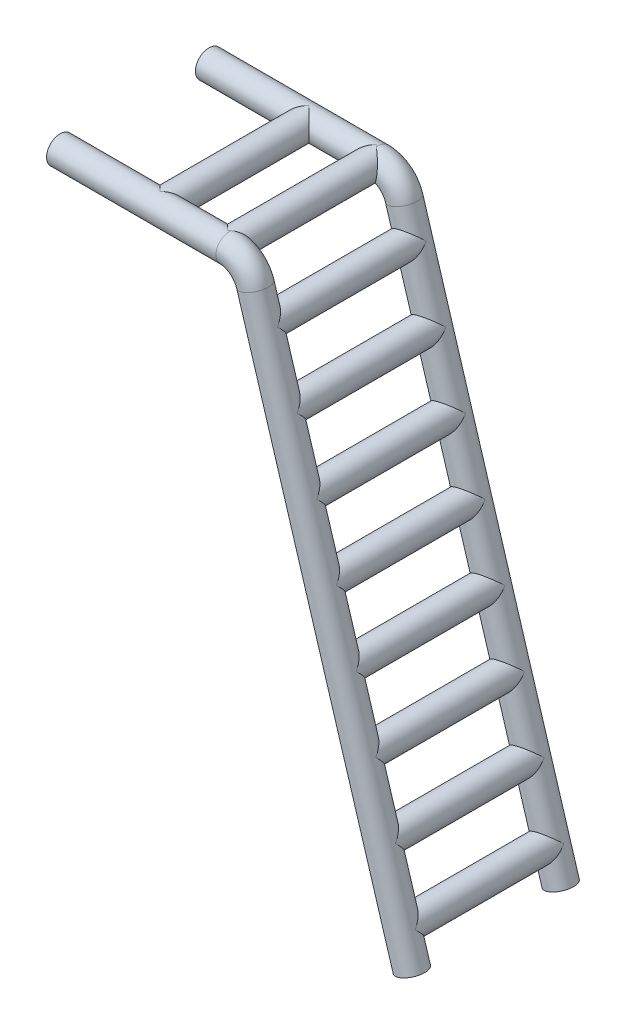
ISO-10303-21;
HEADER;
FILE_DESCRIPTION(('STEP AP214'),'2;1');
FILE_NAME('part.step','',(''),(''),'','','');
FILE_SCHEMA(('AUTOMOTIVE_DESIGN { 1 0 10303 214 1 1 1 1 }'));
ENDSEC;
DATA;
#1=APPLICATION_CONTEXT('core data for automotive mechanical design processes');
#2=APPLICATION_PROTOCOL_DEFINITION('international standard','automotive_design',2000,#1);
#3=PRODUCT_CONTEXT('',#1,'mechanical');
#4=PRODUCT('Part','Part','',(#3));
#5=PRODUCT_RELATED_PRODUCT_CATEGORY('part','',(#4));
#6=PRODUCT_DEFINITION_FORMATION('','',#4);
#7=PRODUCT_DEFINITION_CONTEXT('part definition',#1,'design');
#8=PRODUCT_DEFINITION('design','',#6,#7);
#9=PRODUCT_DEFINITION_SHAPE('','',#8);
#10=(LENGTH_UNIT() NAMED_UNIT(*) SI_UNIT(.MILLI.,.METRE.));
#11=(NAMED_UNIT(*) PLANE_ANGLE_UNIT() SI_UNIT($,.RADIAN.));
#12=(NAMED_UNIT(*) SI_UNIT($,.STERADIAN.) SOLID_ANGLE_UNIT());
#13=UNCERTAINTY_MEASURE_WITH_UNIT(LENGTH_MEASURE(1.E-05),#10,'distance_accuracy_value','');
#14=(GEOMETRIC_REPRESENTATION_CONTEXT(3) GLOBAL_UNCERTAINTY_ASSIGNED_CONTEXT((#13)) GLOBAL_UNIT_ASSIGNED_CONTEXT((#10,
#11,#12)) REPRESENTATION_CONTEXT('',''));
#15=CARTESIAN_POINT('',(0.,0.,0.));
#16=DIRECTION('',(0.,0.,1.));
#17=DIRECTION('',(1.,0.,0.));
#18=AXIS2_PLACEMENT_3D('',#15,#16,#17);
#19=CARTESIAN_POINT('',(0.,197.5,0.));
#20=DIRECTION('',(1.,0.,0.));
#21=DIRECTION('',(0.,0.,-1.));
#22=AXIS2_PLACEMENT_3D('',#19,#20,#21);
#23=CYLINDRICAL_SURFACE('',#22,5.);
#24=CARTESIAN_POINT('',(0.,197.5,0.));
#25=DIRECTION('',(1.,0.,0.));
#26=DIRECTION('',(0.,0.,-1.));
#27=AXIS2_PLACEMENT_3D('',#24,#25,#26);
#28=CIRCLE('',#27,5.);
#29=CARTESIAN_POINT('',(0.,197.5,-5.));
#30=VERTEX_POINT('',#29);
#31=EDGE_CURVE('E368',#30,#30,#28,.T.);
#32=ORIENTED_EDGE('',*,*,#31,.T.);
#33=EDGE_LOOP('',(#32));
#34=FACE_BOUND('',#33,.T.);
#35=CARTESIAN_POINT('',(61.9184050719107,197.5,0.));
#36=DIRECTION('',(0.707106781186547,0.,0.707106781186547));
#37=DIRECTION('',(0.707106781186547,0.,-0.707106781186547));
#38=AXIS2_PLACEMENT_3D('',#35,#36,#37);
#39=ELLIPSE('',#38,7.07106781186549,5.00000000000001);
#40=CARTESIAN_POINT('',(61.9184050719107,192.5,0.));
#41=VERTEX_POINT('',#40);
#42=CARTESIAN_POINT('',(61.9184050719107,202.5,0.));
#43=VERTEX_POINT('',#42);
#44=EDGE_CURVE('E364',#41,#43,#39,.F.);
#45=ORIENTED_EDGE('',*,*,#44,.T.);
#46=CARTESIAN_POINT('',(61.9184050719107,197.5,0.));
#47=DIRECTION('',(0.707106781186547,0.,-0.707106781186547));
#48=DIRECTION('',(0.707106781186547,0.,0.707106781186547));
#49=AXIS2_PLACEMENT_3D('',#46,#47,#48);
#50=ELLIPSE('',#49,7.07106781186549,5.00000000000001);
#51=CARTESIAN_POINT('',(62.5866929354734,202.455137872089,0.668287863562589));
#52=VERTEX_POINT('',#51);
#53=EDGE_CURVE('E363',#43,#52,#50,.T.);
#54=ORIENTED_EDGE('',*,*,#53,.T.);
#55=CARTESIAN_POINT('',(62.5866929354592,197.5,0.));
#56=DIRECTION('',(1.,0.,0.));
#57=DIRECTION('',(0.,0.,-1.));
#58=AXIS2_PLACEMENT_3D('',#55,#56,#57);
#59=CIRCLE('',#58,5.);
#60=CARTESIAN_POINT('',(62.5866929354592,192.544862127907,0.668287863534219));
#61=VERTEX_POINT('',#60);
#62=EDGE_CURVE('E372',#61,#52,#59,.T.);
#63=ORIENTED_EDGE('',*,*,#62,.F.);
#64=EDGE_CURVE('E359',#61,#41,#50,.T.);
#65=ORIENTED_EDGE('',*,*,#64,.T.);
#66=EDGE_LOOP('',(#45,#54,#63,#65));
#67=FACE_BOUND('',#66,.T.);
#68=CARTESIAN_POINT('',(36.9184050719107,197.5,0.));
#69=DIRECTION('',(0.707106781186547,0.,0.707106781186547));
#70=DIRECTION('',(0.707106781186547,0.,-0.707106781186547));
#71=AXIS2_PLACEMENT_3D('',#68,#69,#70);
#72=ELLIPSE('',#71,7.07106781186549,5.00000000000001);
#73=CARTESIAN_POINT('',(36.9184050719107,192.5,0.));
#74=VERTEX_POINT('',#73);
#75=CARTESIAN_POINT('',(36.9184050719107,202.5,0.));
#76=VERTEX_POINT('',#75);
#77=EDGE_CURVE('E456',#74,#76,#72,.F.);
#78=ORIENTED_EDGE('',*,*,#77,.T.);
#79=CARTESIAN_POINT('',(36.9184050719107,197.5,0.));
#80=DIRECTION('',(0.707106781186547,0.,-0.707106781186547));
#81=DIRECTION('',(0.707106781186547,0.,0.707106781186547));
#82=AXIS2_PLACEMENT_3D('',#79,#80,#81);
#83=ELLIPSE('',#82,7.07106781186549,5.00000000000001);
#84=EDGE_CURVE('E120',#76,#74,#83,.T.);
#85=ORIENTED_EDGE('',*,*,#84,.T.);
#86=EDGE_LOOP('',(#78,#85));
#87=FACE_BOUND('',#86,.T.);
#88=ADVANCED_FACE('F105',(#34,#67,#87),#23,.T.);
#89=CARTESIAN_POINT('',(62.5866929354592,187.5,0.));
#90=DIRECTION('',(0.,0.,-1.));
#91=DIRECTION('',(-1.,0.,0.));
#92=AXIS2_PLACEMENT_3D('',#89,#90,#91);
#93=TOROIDAL_SURFACE('',#92,10.,5.);
#94=CARTESIAN_POINT('',(72.1548973347256,190.406796273195,0.));
#95=DIRECTION('',(0.290679627319484,-0.956820439926638,0.));
#96=DIRECTION('',(0.,0.,-1.));
#97=AXIS2_PLACEMENT_3D('',#94,#95,#96);
#98=CIRCLE('',#97,5.);
#99=CARTESIAN_POINT('',(72.1548973347256,190.406796273195,-5.));
#100=VERTEX_POINT('',#99);
#101=EDGE_CURVE('E376',#100,#100,#98,.T.);
#102=ORIENTED_EDGE('',*,*,#101,.F.);
#103=EDGE_LOOP('',(#102));
#104=FACE_BOUND('',#103,.T.);
#105=ORIENTED_EDGE('',*,*,#62,.T.);
#106=CARTESIAN_POINT('',(62.5864929354592,202.455164841514,0.668087853629485));
#107=CARTESIAN_POINT('',(62.6611183955914,202.445139452581,0.742269202189964));
#108=CARTESIAN_POINT('',(62.7371285084318,202.433141385632,0.814720385409346));
#109=CARTESIAN_POINT('',(62.8906783188717,202.405167967597,0.95716398057671));
#110=CARTESIAN_POINT('',(62.9682176335223,202.389193600914,1.0271569962006));
#111=CARTESIAN_POINT('',(63.1236357269552,202.353228074582,1.16573173611183));
#112=CARTESIAN_POINT('',(63.2015145541961,202.333236321861,1.23431325037422));
#113=CARTESIAN_POINT('',(63.3571175354711,202.289221019917,1.3703510263028));
#114=CARTESIAN_POINT('',(63.4348416792604,202.265197212083,1.43780721548633));
#115=CARTESIAN_POINT('',(63.6684857483693,202.186614880612,1.63991503024961));
#116=CARTESIAN_POINT('',(63.8235789969003,202.125841522905,1.77316802854014));
#117=CARTESIAN_POINT('',(64.1292589342429,201.987791959425,2.03620572088656));
#118=CARTESIAN_POINT('',(64.2798459254174,201.910516863737,2.16599064758185));
#119=CARTESIAN_POINT('',(64.5784011095229,201.737326173623,2.42499263315125));
#120=CARTESIAN_POINT('',(64.7262112438005,201.640995095594,2.55411544188455));
#121=CARTESIAN_POINT('',(65.0133266838961,201.43104335284,2.80778092509025));
#122=CARTESIAN_POINT('',(65.1526305023492,201.317419676494,2.93232279706149));
#123=CARTESIAN_POINT('',(65.4202475696997,201.073479412552,3.17545517156974));
#124=CARTESIAN_POINT('',(65.5485978949837,200.943223193934,3.29406513840678));
#125=CARTESIAN_POINT('',(65.7926474134279,200.666122678001,3.52453478897464));
#126=CARTESIAN_POINT('',(65.9083530564968,200.519286916178,3.63639790102712));
#127=CARTESIAN_POINT('',(66.1634411226332,200.154294493682,3.89035539746386));
#128=CARTESIAN_POINT('',(66.2966310579024,199.929332874801,4.02907092333381));
#129=CARTESIAN_POINT('',(66.5291759854502,199.452211931506,4.28660087547002));
#130=CARTESIAN_POINT('',(66.6285643133016,199.200079728206,4.40543485004966));
#131=CARTESIAN_POINT('',(66.7726969565931,198.719455793191,4.59818542935828));
#132=CARTESIAN_POINT('',(66.8239987429483,198.494676110905,4.67632934421049));
#133=CARTESIAN_POINT('',(66.8774652959444,198.149123890233,4.77683803552706));
#134=CARTESIAN_POINT('',(66.8913739857207,198.032494304266,4.80756535865547));
#135=CARTESIAN_POINT('',(66.9109637448681,197.797120025511,4.86284353148415));
#136=CARTESIAN_POINT('',(66.9166485531549,197.678376318764,4.88739718379211));
#137=CARTESIAN_POINT('',(66.9194781705201,197.438538409945,4.92989843284707));
#138=CARTESIAN_POINT('',(66.9165484663898,197.317432753428,4.94778687352747));
#139=CARTESIAN_POINT('',(66.9017837552902,197.074934941454,4.97602824369316));
#140=CARTESIAN_POINT('',(66.8899534446062,196.953542970727,4.98638514143035));
#141=CARTESIAN_POINT('',(66.857364716696,196.711604662361,4.99901308722723));
#142=CARTESIAN_POINT('',(66.836611751147,196.591057853967,5.00128906482182));
#143=CARTESIAN_POINT('',(66.7863511689762,196.351950692199,4.99731597497589));
#144=CARTESIAN_POINT('',(66.7568449746408,196.233390019407,4.99106829192695));
#145=CARTESIAN_POINT('',(66.6941117550653,196.015526335228,4.9712253378769));
#146=CARTESIAN_POINT('',(66.6619492724375,195.915811396035,4.95875470650152));
#147=CARTESIAN_POINT('',(66.5918028005951,195.719488810329,4.92718278067469));
#148=CARTESIAN_POINT('',(66.5538170177167,195.622882132337,4.90807944094879));
#149=CARTESIAN_POINT('',(66.4725643532017,195.433543260687,4.86330432313619));
#150=CARTESIAN_POINT('',(66.4292996795599,195.34080946876,4.83763528638301));
#151=CARTESIAN_POINT('',(66.3380625499701,195.159719512614,4.77988670457977));
#152=CARTESIAN_POINT('',(66.290088319005,195.071365017966,4.74780473775957));
#153=CARTESIAN_POINT('',(66.1919107174733,194.902630408045,4.67878528885342));
#154=CARTESIAN_POINT('',(66.1418508201996,194.822077428124,4.64206550598394));
#155=CARTESIAN_POINT('',(66.0385744836408,194.665746407216,4.56326009885023));
#156=CARTESIAN_POINT('',(65.9853568816876,194.589970146465,4.52117249151217));
#157=CARTESIAN_POINT('',(65.8219686917754,194.370233857199,4.38749396348193));
#158=CARTESIAN_POINT('',(65.7079140684997,194.233615744542,4.28838322128656));
#159=CARTESIAN_POINT('',(65.5024139139876,194.011167197106,4.09981940227379));
#160=CARTESIAN_POINT('',(65.412223546569,193.921069365195,4.01388874730614));
#161=CARTESIAN_POINT('',(65.2297559318172,193.751607090382,3.83391078912698));
#162=CARTESIAN_POINT('',(65.1374776447352,193.672248138966,3.73985937320895));
#163=CARTESIAN_POINT('',(64.9513010126918,193.523080782839,3.54430672696414));
#164=CARTESIAN_POINT('',(64.8573957439527,193.453346921135,3.44275578781625));
#165=CARTESIAN_POINT('',(64.6694113014813,193.323275715494,3.23405016982432));
#166=CARTESIAN_POINT('',(64.5753321764052,193.262936056039,3.12689688059446));
#167=CARTESIAN_POINT('',(64.4020092273746,193.159463660693,2.92499074178849));
#168=CARTESIAN_POINT('',(64.3227253134727,193.115113421258,2.83088891890509));
#169=CARTESIAN_POINT('',(64.1644765056404,193.031985513317,2.63997516761242));
#170=CARTESIAN_POINT('',(64.0855116650162,192.993208741343,2.54316280617878));
#171=CARTESIAN_POINT('',(63.9278256383166,192.920723852852,2.34722174118069));
#172=CARTESIAN_POINT('',(63.8491049840431,192.887023303637,2.24808982902537));
#173=CARTESIAN_POINT('',(63.6919318035493,192.824343590708,2.04814815240428));
#174=CARTESIAN_POINT('',(63.6134792701837,192.795364300198,1.94733843307909));
#175=CARTESIAN_POINT('',(63.458532884658,192.742422837542,1.74708160415776));
#176=CARTESIAN_POINT('',(63.3820387130041,192.71835405622,1.64766271204512));
#177=CARTESIAN_POINT('',(63.2286171486519,192.674056239257,1.44832385929399));
#178=CARTESIAN_POINT('',(63.1516898057291,192.653826771354,1.34840395636522));
#179=CARTESIAN_POINT('',(63.0352993118148,192.626179675196,1.19906916736686));
#180=CARTESIAN_POINT('',(62.9963987322633,192.617425318685,1.14946043408808));
#181=CARTESIAN_POINT('',(62.9179565850585,192.600764723479,1.05062443805327));
#182=CARTESIAN_POINT('',(62.8784151528061,192.592858308249,1.00139709788217));
#183=CARTESIAN_POINT('',(62.7982028226284,192.577843285985,0.903683032913863));
#184=CARTESIAN_POINT('',(62.7575312260473,192.570735186792,0.855196796314696));
#185=CARTESIAN_POINT('',(62.6949656918385,192.5606275375,0.783710057129077));
#186=CARTESIAN_POINT('',(62.6738428050538,192.557349639249,0.760079823345933));
#187=CARTESIAN_POINT('',(62.6308160799562,192.550965970919,0.713501459432533));
#188=CARTESIAN_POINT('',(62.6089119147417,192.547860274314,0.690553622371929));
#189=CARTESIAN_POINT('',(62.5864929354592,192.544835158486,0.668087892952457));
#190=B_SPLINE_CURVE_WITH_KNOTS('',3,(#106,#107,#108,#109,#110,#111,#112,#113,#114,#115,#116,
#117,#118,#119,#120,#121,#122,#123,#124,#125,#126,#127,#128,#129,#130,#131,#132,#133,#134,#135,
#136,#137,#138,#139,#140,#141,#142,#143,#144,#145,#146,#147,#148,#149,#150,#151,#152,#153,#154,
#155,#156,#157,#158,#159,#160,#161,#162,#163,#164,#165,#166,#167,#168,#169,#170,#171,#172,#173,
#174,#175,#176,#177,#178,#179,#180,#181,#182,#183,#184,#185,#186,#187,#188,#189),.UNSPECIFIED.,
.F.,.F.,(4,2,2,2,2,2,2,2,2,2,2,2,2,2,2,2,2,2,2,2,2,2,2,2,2,2,2,2,2,2,2,2,2,2,2,2,2,2,2,2,2,4),
(0.,0.316987456667242,0.633896515442782,0.950852392820062,1.26782860724845,1.90702102299064,
2.54617045330544,3.20120215618385,3.85634806804363,4.50918029828965,5.16167795642804,
6.04599006888245,6.92942751526569,7.6565320425575,8.020375890554,8.38405426809025,
8.75088759351942,9.1175274999047,9.48394370960626,9.8503004139906,10.1664356265297,
10.4826684098247,10.7987693733803,11.1149899351615,11.4197682437027,11.7246594766109,
12.3335230294077,12.7941667214128,13.2550450873398,13.7193134600982,14.183467216463,
14.5757053087619,14.9680064250214,15.3608866903613,15.7537564024837,16.1368820607092,
16.5199645578279,16.7108977588799,16.9017911317929,17.0928052602437,17.1883823325504,
17.2839998763865),.UNSPECIFIED.);
#191=EDGE_CURVE('E447',#52,#61,#190,.T.);
#192=ORIENTED_EDGE('',*,*,#191,.T.);
#193=EDGE_LOOP('',(#105,#192));
#194=FACE_BOUND('',#193,.T.);
#195=ADVANCED_FACE('F457',(#104,#194),#93,.T.);
#196=CARTESIAN_POINT('',(72.1548973347256,190.406796273195,0.));
#197=DIRECTION('',(0.290679627319485,-0.956820439926638,0.));
#198=DIRECTION('',(0.956820439926638,0.290679627319485,0.));
#199=AXIS2_PLACEMENT_3D('',#196,#197,#198);
#200=CYLINDRICAL_SURFACE('',#199,5.);
#201=CARTESIAN_POINT('',(130.,0.,0.));
#202=DIRECTION('',(0.290679627319485,-0.956820439926638,0.));
#203=DIRECTION('',(0.,0.,-1.));
#204=AXIS2_PLACEMENT_3D('',#201,#202,#203);
#205=CIRCLE('',#204,5.);
#206=CARTESIAN_POINT('',(130.,0.,-5.));
#207=VERTEX_POINT('',#206);
#208=EDGE_CURVE('E380',#207,#207,#205,.T.);
#209=ORIENTED_EDGE('',*,*,#208,.F.);
#210=EDGE_LOOP('',(#209));
#211=FACE_BOUND('',#210,.T.);
#212=ORIENTED_EDGE('',*,*,#101,.T.);
#213=EDGE_LOOP('',(#212));
#214=FACE_BOUND('',#213,.T.);
#215=CARTESIAN_POINT('',(126.387902166317,11.8898220358719,0.));
#216=DIRECTION('',(0.205541535630386,-0.676574221450021,0.707106781186547));
#217=DIRECTION('',(0.205541535630386,-0.676574221450021,-0.707106781186547));
#218=AXIS2_PLACEMENT_3D('',#215,#216,#217);
#219=ELLIPSE('',#218,7.07106781186549,5.00000000000001);
#220=CARTESIAN_POINT('',(121.603799966684,10.4364238992745,0.));
#221=VERTEX_POINT('',#220);
#222=CARTESIAN_POINT('',(131.172004365951,13.3432201724694,0.));
#223=VERTEX_POINT('',#222);
#224=EDGE_CURVE('E383',#221,#223,#219,.F.);
#225=ORIENTED_EDGE('',*,*,#224,.T.);
#226=CARTESIAN_POINT('',(126.387902166317,11.8898220358719,0.));
#227=DIRECTION('',(0.205541535630386,-0.676574221450021,-0.707106781186547));
#228=DIRECTION('',(0.205541535630386,-0.676574221450021,0.707106781186547));
#229=AXIS2_PLACEMENT_3D('',#226,#227,#228);
#230=ELLIPSE('',#229,7.07106781186549,5.00000000000001);
#231=EDGE_CURVE('E387',#223,#221,#230,.T.);
#232=ORIENTED_EDGE('',*,*,#231,.T.);
#233=EDGE_LOOP('',(#225,#232));
#234=FACE_BOUND('',#233,.T.);
#235=CARTESIAN_POINT('',(119.12091148333,35.8103330340379,0.));
#236=DIRECTION('',(0.205541535630386,-0.676574221450021,0.707106781186547));
#237=DIRECTION('',(0.205541535630386,-0.676574221450021,-0.707106781186547));
#238=AXIS2_PLACEMENT_3D('',#235,#236,#237);
#239=ELLIPSE('',#238,7.07106781186549,5.00000000000001);
#240=CARTESIAN_POINT('',(114.336809283697,34.3569348974405,0.));
#241=VERTEX_POINT('',#240);
#242=CARTESIAN_POINT('',(123.905013682963,37.2637311706354,0.));
#243=VERTEX_POINT('',#242);
#244=EDGE_CURVE('E391',#241,#243,#239,.F.);
#245=ORIENTED_EDGE('',*,*,#244,.T.);
#246=CARTESIAN_POINT('',(119.12091148333,35.8103330340379,0.));
#247=DIRECTION('',(0.205541535630386,-0.676574221450021,-0.707106781186547));
#248=DIRECTION('',(0.205541535630386,-0.676574221450021,0.707106781186547));
#249=AXIS2_PLACEMENT_3D('',#246,#247,#248);
#250=ELLIPSE('',#249,7.07106781186549,5.00000000000001);
#251=EDGE_CURVE('E395',#243,#241,#250,.T.);
#252=ORIENTED_EDGE('',*,*,#251,.T.);
#253=EDGE_LOOP('',(#245,#252));
#254=FACE_BOUND('',#253,.T.);
#255=CARTESIAN_POINT('',(111.853920800343,59.7308440322038,0.));
#256=DIRECTION('',(0.205541535630386,-0.676574221450021,0.707106781186547));
#257=DIRECTION('',(0.205541535630386,-0.676574221450021,-0.707106781186547));
#258=AXIS2_PLACEMENT_3D('',#255,#256,#257);
#259=ELLIPSE('',#258,7.07106781186549,5.00000000000001);
#260=CARTESIAN_POINT('',(107.06981860071,58.2774458956064,0.));
#261=VERTEX_POINT('',#260);
#262=CARTESIAN_POINT('',(116.638022999976,61.1842421688012,0.));
#263=VERTEX_POINT('',#262);
#264=EDGE_CURVE('E399',#261,#263,#259,.F.);
#265=ORIENTED_EDGE('',*,*,#264,.T.);
#266=CARTESIAN_POINT('',(111.853920800343,59.7308440322038,0.));
#267=DIRECTION('',(0.205541535630386,-0.676574221450021,-0.707106781186547));
#268=DIRECTION('',(0.205541535630386,-0.676574221450021,0.707106781186547));
#269=AXIS2_PLACEMENT_3D('',#266,#267,#268);
#270=ELLIPSE('',#269,7.07106781186549,5.00000000000001);
#271=EDGE_CURVE('E403',#263,#261,#270,.T.);
#272=ORIENTED_EDGE('',*,*,#271,.T.);
#273=EDGE_LOOP('',(#265,#272));
#274=FACE_BOUND('',#273,.T.);
#275=CARTESIAN_POINT('',(104.586930117356,83.6513550303698,0.));
#276=DIRECTION('',(0.205541535630386,-0.676574221450021,0.707106781186547));
#277=DIRECTION('',(0.205541535630386,-0.676574221450021,-0.707106781186547));
#278=AXIS2_PLACEMENT_3D('',#275,#276,#277);
#279=ELLIPSE('',#278,7.07106781186549,5.00000000000001);
#280=CARTESIAN_POINT('',(99.8028279177228,82.1979568937724,0.));
#281=VERTEX_POINT('',#280);
#282=CARTESIAN_POINT('',(109.371032316989,85.1047531669672,0.));
#283=VERTEX_POINT('',#282);
#284=EDGE_CURVE('E407',#281,#283,#279,.F.);
#285=ORIENTED_EDGE('',*,*,#284,.T.);
#286=CARTESIAN_POINT('',(104.586930117356,83.6513550303698,0.));
#287=DIRECTION('',(0.205541535630386,-0.676574221450021,-0.707106781186547));
#288=DIRECTION('',(0.205541535630386,-0.676574221450021,0.707106781186547));
#289=AXIS2_PLACEMENT_3D('',#286,#287,#288);
#290=ELLIPSE('',#289,7.07106781186549,5.00000000000001);
#291=EDGE_CURVE('E411',#283,#281,#290,.T.);
#292=ORIENTED_EDGE('',*,*,#291,.T.);
#293=EDGE_LOOP('',(#285,#292));
#294=FACE_BOUND('',#293,.T.);
#295=CARTESIAN_POINT('',(97.3199394343689,107.571866028536,0.));
#296=DIRECTION('',(0.205541535630386,-0.676574221450021,0.707106781186547));
#297=DIRECTION('',(0.205541535630386,-0.676574221450021,-0.707106781186547));
#298=AXIS2_PLACEMENT_3D('',#295,#296,#297);
#299=ELLIPSE('',#298,7.07106781186549,5.00000000000001);
#300=CARTESIAN_POINT('',(92.5358372347357,106.118467891938,0.));
#301=VERTEX_POINT('',#300);
#302=CARTESIAN_POINT('',(102.104041634002,109.025264165133,0.));
#303=VERTEX_POINT('',#302);
#304=EDGE_CURVE('E415',#301,#303,#299,.F.);
#305=ORIENTED_EDGE('',*,*,#304,.T.);
#306=CARTESIAN_POINT('',(97.3199394343689,107.571866028536,0.));
#307=DIRECTION('',(0.205541535630386,-0.676574221450021,-0.707106781186547));
#308=DIRECTION('',(0.205541535630386,-0.676574221450021,0.707106781186547));
#309=AXIS2_PLACEMENT_3D('',#306,#307,#308);
#310=ELLIPSE('',#309,7.07106781186549,5.00000000000001);
#311=EDGE_CURVE('E419',#303,#301,#310,.T.);
#312=ORIENTED_EDGE('',*,*,#311,.T.);
#313=EDGE_LOOP('',(#305,#312));
#314=FACE_BOUND('',#313,.T.);
#315=CARTESIAN_POINT('',(90.0529487513818,131.492377026702,0.));
#316=DIRECTION('',(0.205541535630386,-0.676574221450021,0.707106781186547));
#317=DIRECTION('',(0.205541535630386,-0.676574221450021,-0.707106781186547));
#318=AXIS2_PLACEMENT_3D('',#315,#316,#317);
#319=ELLIPSE('',#318,7.07106781186549,5.00000000000001);
#320=CARTESIAN_POINT('',(85.2688465517486,130.038978890104,0.));
#321=VERTEX_POINT('',#320);
#322=CARTESIAN_POINT('',(94.837050951015,132.945775163299,0.));
#323=VERTEX_POINT('',#322);
#324=EDGE_CURVE('E423',#321,#323,#319,.F.);
#325=ORIENTED_EDGE('',*,*,#324,.T.);
#326=CARTESIAN_POINT('',(90.0529487513818,131.492377026702,0.));
#327=DIRECTION('',(0.205541535630386,-0.676574221450021,-0.707106781186547));
#328=DIRECTION('',(0.205541535630386,-0.676574221450021,0.707106781186547));
#329=AXIS2_PLACEMENT_3D('',#326,#327,#328);
#330=ELLIPSE('',#329,7.07106781186549,5.00000000000001);
#331=EDGE_CURVE('E427',#323,#321,#330,.T.);
#332=ORIENTED_EDGE('',*,*,#331,.T.);
#333=EDGE_LOOP('',(#325,#332));
#334=FACE_BOUND('',#333,.T.);
#335=CARTESIAN_POINT('',(82.7859580683946,155.412888024868,0.));
#336=DIRECTION('',(0.205541535630386,-0.676574221450021,0.707106781186547));
#337=DIRECTION('',(0.205541535630386,-0.676574221450021,-0.707106781186547));
#338=AXIS2_PLACEMENT_3D('',#335,#336,#337);
#339=ELLIPSE('',#338,7.07106781186549,5.00000000000001);
#340=CARTESIAN_POINT('',(78.0018558687615,153.95948988827,0.));
#341=VERTEX_POINT('',#340);
#342=CARTESIAN_POINT('',(87.5700602680279,156.866286161465,0.));
#343=VERTEX_POINT('',#342);
#344=EDGE_CURVE('E431',#341,#343,#339,.F.);
#345=ORIENTED_EDGE('',*,*,#344,.T.);
#346=CARTESIAN_POINT('',(82.7859580683946,155.412888024868,0.));
#347=DIRECTION('',(0.205541535630386,-0.676574221450021,-0.707106781186547));
#348=DIRECTION('',(0.205541535630386,-0.676574221450021,0.707106781186547));
#349=AXIS2_PLACEMENT_3D('',#346,#347,#348);
#350=ELLIPSE('',#349,7.07106781186549,5.00000000000001);
#351=EDGE_CURVE('E435',#343,#341,#350,.T.);
#352=ORIENTED_EDGE('',*,*,#351,.T.);
#353=EDGE_LOOP('',(#345,#352));
#354=FACE_BOUND('',#353,.T.);
#355=CARTESIAN_POINT('',(75.5189673854075,179.333399023034,0.));
#356=DIRECTION('',(0.205541535630386,-0.676574221450021,0.707106781186547));
#357=DIRECTION('',(0.205541535630386,-0.676574221450021,-0.707106781186547));
#358=AXIS2_PLACEMENT_3D('',#355,#356,#357);
#359=ELLIPSE('',#358,7.07106781186549,5.00000000000001);
#360=CARTESIAN_POINT('',(70.7348651857743,177.880000886436,0.));
#361=VERTEX_POINT('',#360);
#362=CARTESIAN_POINT('',(80.3030695850407,180.786797159631,0.));
#363=VERTEX_POINT('',#362);
#364=EDGE_CURVE('E439',#361,#363,#359,.F.);
#365=ORIENTED_EDGE('',*,*,#364,.T.);
#366=CARTESIAN_POINT('',(75.5189673854075,179.333399023034,0.));
#367=DIRECTION('',(0.205541535630386,-0.676574221450021,-0.707106781186547));
#368=DIRECTION('',(0.205541535630386,-0.676574221450021,0.707106781186547));
#369=AXIS2_PLACEMENT_3D('',#366,#367,#368);
#370=ELLIPSE('',#369,7.07106781186549,5.00000000000001);
#371=EDGE_CURVE('E443',#363,#361,#370,.T.);
#372=ORIENTED_EDGE('',*,*,#371,.T.);
#373=EDGE_LOOP('',(#365,#372));
#374=FACE_BOUND('',#373,.T.);
#375=ADVANCED_FACE('F507',(#211,#214,#234,#254,#274,#294,#314,#334,#354,#374),#200,.T.);
#376=CARTESIAN_POINT('',(0.,197.5,0.));
#377=DIRECTION('',(1.,0.,0.));
#378=DIRECTION('',(0.,0.,-1.));
#379=AXIS2_PLACEMENT_3D('',#376,#377,#378);
#380=PLANE('',#379);
#381=ORIENTED_EDGE('',*,*,#31,.F.);
#382=EDGE_LOOP('',(#381));
#383=FACE_BOUND('',#382,.T.);
#384=ADVANCED_FACE('F107',(#383),#380,.F.);
#385=CARTESIAN_POINT('',(130.,0.,0.));
#386=DIRECTION('',(0.290679627319485,-0.956820439926638,0.));
#387=DIRECTION('',(0.,0.,-1.));
#388=AXIS2_PLACEMENT_3D('',#385,#386,#387);
#389=PLANE('',#388);
#390=ORIENTED_EDGE('',*,*,#208,.T.);
#391=EDGE_LOOP('',(#390));
#392=FACE_BOUND('',#391,.T.);
#393=ADVANCED_FACE('F500',(#392),#389,.T.);
#394=CARTESIAN_POINT('',(126.387902166317,11.8898220358719,55.));
#395=DIRECTION('',(0.,0.,-1.));
#396=DIRECTION('',(-1.,0.,0.));
#397=AXIS2_PLACEMENT_3D('',#394,#395,#396);
#398=CYLINDRICAL_SURFACE('',#397,5.00000000000002);
#399=ORIENTED_EDGE('',*,*,#231,.F.);
#400=ORIENTED_EDGE('',*,*,#224,.F.);
#401=EDGE_LOOP('',(#399,#400));
#402=FACE_BOUND('',#401,.T.);
#403=CARTESIAN_POINT('',(126.387902166317,11.8898220358719,55.));
#404=DIRECTION('',(-0.205541535630386,0.676574221450021,-0.707106781186547));
#405=DIRECTION('',(0.205541535630386,-0.676574221450021,-0.707106781186547));
#406=AXIS2_PLACEMENT_3D('',#403,#404,#405);
#407=ELLIPSE('',#406,7.07106781186549,5.00000000000001);
#408=CARTESIAN_POINT('',(131.172004365951,13.3432201724694,55.));
#409=VERTEX_POINT('',#408);
#410=CARTESIAN_POINT('',(121.603799966684,10.4364238992745,55.));
#411=VERTEX_POINT('',#410);
#412=EDGE_CURVE('E354',#409,#411,#407,.T.);
#413=ORIENTED_EDGE('',*,*,#412,.T.);
#414=CARTESIAN_POINT('',(126.387902166317,11.8898220358719,55.));
#415=DIRECTION('',(0.205541535630386,-0.676574221450021,-0.707106781186547));
#416=DIRECTION('',(-0.205541535630386,0.676574221450021,-0.707106781186547));
#417=AXIS2_PLACEMENT_3D('',#414,#415,#416);
#418=ELLIPSE('',#417,7.07106781186549,5.00000000000001);
#419=EDGE_CURVE('E126',#411,#409,#418,.T.);
#420=ORIENTED_EDGE('',*,*,#419,.T.);
#421=EDGE_LOOP('',(#413,#420));
#422=FACE_BOUND('',#421,.T.);
#423=ADVANCED_FACE('F497',(#402,#422),#398,.T.);
#424=CARTESIAN_POINT('',(119.12091148333,35.8103330340379,55.));
#425=DIRECTION('',(0.,0.,-1.));
#426=DIRECTION('',(-1.,0.,0.));
#427=AXIS2_PLACEMENT_3D('',#424,#425,#426);
#428=CYLINDRICAL_SURFACE('',#427,5.00000000000002);
#429=ORIENTED_EDGE('',*,*,#251,.F.);
#430=ORIENTED_EDGE('',*,*,#244,.F.);
#431=EDGE_LOOP('',(#429,#430));
#432=FACE_BOUND('',#431,.T.);
#433=CARTESIAN_POINT('',(119.12091148333,35.8103330340379,55.));
#434=DIRECTION('',(-0.205541535630386,0.676574221450021,-0.707106781186547));
#435=DIRECTION('',(0.205541535630386,-0.676574221450021,-0.707106781186547));
#436=AXIS2_PLACEMENT_3D('',#433,#434,#435);
#437=ELLIPSE('',#436,7.07106781186549,5.00000000000001);
#438=CARTESIAN_POINT('',(123.905013682963,37.2637311706354,55.));
#439=VERTEX_POINT('',#438);
#440=CARTESIAN_POINT('',(114.336809283697,34.3569348974405,55.));
#441=VERTEX_POINT('',#440);
#442=EDGE_CURVE('E349',#439,#441,#437,.T.);
#443=ORIENTED_EDGE('',*,*,#442,.T.);
#444=CARTESIAN_POINT('',(119.12091148333,35.8103330340379,55.));
#445=DIRECTION('',(0.205541535630386,-0.676574221450021,-0.707106781186547));
#446=DIRECTION('',(-0.205541535630386,0.676574221450021,-0.707106781186547));
#447=AXIS2_PLACEMENT_3D('',#444,#445,#446);
#448=ELLIPSE('',#447,7.07106781186549,5.00000000000001);
#449=EDGE_CURVE('E133',#441,#439,#448,.T.);
#450=ORIENTED_EDGE('',*,*,#449,.T.);
#451=EDGE_LOOP('',(#443,#450));
#452=FACE_BOUND('',#451,.T.);
#453=ADVANCED_FACE('F493',(#432,#452),#428,.T.);
#454=CARTESIAN_POINT('',(111.853920800343,59.7308440322038,55.));
#455=DIRECTION('',(0.,0.,-1.));
#456=DIRECTION('',(-1.,0.,0.));
#457=AXIS2_PLACEMENT_3D('',#454,#455,#456);
#458=CYLINDRICAL_SURFACE('',#457,5.00000000000002);
#459=ORIENTED_EDGE('',*,*,#271,.F.);
#460=ORIENTED_EDGE('',*,*,#264,.F.);
#461=EDGE_LOOP('',(#459,#460));
#462=FACE_BOUND('',#461,.T.);
#463=CARTESIAN_POINT('',(111.853920800343,59.7308440322038,55.));
#464=DIRECTION('',(-0.205541535630386,0.676574221450021,-0.707106781186547));
#465=DIRECTION('',(0.205541535630386,-0.676574221450021,-0.707106781186547));
#466=AXIS2_PLACEMENT_3D('',#463,#464,#465);
#467=ELLIPSE('',#466,7.07106781186549,5.00000000000001);
#468=CARTESIAN_POINT('',(116.638022999976,61.1842421688012,55.));
#469=VERTEX_POINT('',#468);
#470=CARTESIAN_POINT('',(107.06981860071,58.2774458956064,55.));
#471=VERTEX_POINT('',#470);
#472=EDGE_CURVE('E341',#469,#471,#467,.T.);
#473=ORIENTED_EDGE('',*,*,#472,.T.);
#474=CARTESIAN_POINT('',(111.853920800343,59.7308440322038,55.));
#475=DIRECTION('',(0.205541535630386,-0.676574221450021,-0.707106781186547));
#476=DIRECTION('',(-0.205541535630386,0.676574221450021,-0.707106781186547));
#477=AXIS2_PLACEMENT_3D('',#474,#475,#476);
#478=ELLIPSE('',#477,7.07106781186549,5.00000000000001);
#479=EDGE_CURVE('E345',#471,#469,#478,.T.);
#480=ORIENTED_EDGE('',*,*,#479,.T.);
#481=EDGE_LOOP('',(#473,#480));
#482=FACE_BOUND('',#481,.T.);
#483=ADVANCED_FACE('F489',(#462,#482),#458,.T.);
#484=CARTESIAN_POINT('',(104.586930117356,83.6513550303698,55.));
#485=DIRECTION('',(0.,0.,-1.));
#486=DIRECTION('',(-1.,0.,0.));
#487=AXIS2_PLACEMENT_3D('',#484,#485,#486);
#488=CYLINDRICAL_SURFACE('',#487,5.00000000000002);
#489=ORIENTED_EDGE('',*,*,#291,.F.);
#490=ORIENTED_EDGE('',*,*,#284,.F.);
#491=EDGE_LOOP('',(#489,#490));
#492=FACE_BOUND('',#491,.T.);
#493=CARTESIAN_POINT('',(104.586930117356,83.6513550303698,55.));
#494=DIRECTION('',(-0.205541535630386,0.676574221450021,-0.707106781186547));
#495=DIRECTION('',(0.205541535630386,-0.676574221450021,-0.707106781186547));
#496=AXIS2_PLACEMENT_3D('',#493,#494,#495);
#497=ELLIPSE('',#496,7.07106781186549,5.00000000000001);
#498=CARTESIAN_POINT('',(109.371032316989,85.1047531669672,55.));
#499=VERTEX_POINT('',#498);
#500=CARTESIAN_POINT('',(99.8028279177228,82.1979568937724,55.));
#501=VERTEX_POINT('',#500);
#502=EDGE_CURVE('E333',#499,#501,#497,.T.);
#503=ORIENTED_EDGE('',*,*,#502,.T.);
#504=CARTESIAN_POINT('',(104.586930117356,83.6513550303698,55.));
#505=DIRECTION('',(0.205541535630386,-0.676574221450021,-0.707106781186547));
#506=DIRECTION('',(-0.205541535630386,0.676574221450021,-0.707106781186547));
#507=AXIS2_PLACEMENT_3D('',#504,#505,#506);
#508=ELLIPSE('',#507,7.07106781186549,5.00000000000001);
#509=EDGE_CURVE('E337',#501,#499,#508,.T.);
#510=ORIENTED_EDGE('',*,*,#509,.T.);
#511=EDGE_LOOP('',(#503,#510));
#512=FACE_BOUND('',#511,.T.);
#513=ADVANCED_FACE('F485',(#492,#512),#488,.T.);
#514=CARTESIAN_POINT('',(97.3199394343689,107.571866028536,55.));
#515=DIRECTION('',(0.,0.,-1.));
#516=DIRECTION('',(-1.,0.,0.));
#517=AXIS2_PLACEMENT_3D('',#514,#515,#516);
#518=CYLINDRICAL_SURFACE('',#517,5.00000000000002);
#519=ORIENTED_EDGE('',*,*,#311,.F.);
#520=ORIENTED_EDGE('',*,*,#304,.F.);
#521=EDGE_LOOP('',(#519,#520));
#522=FACE_BOUND('',#521,.T.);
#523=CARTESIAN_POINT('',(97.3199394343689,107.571866028536,55.));
#524=DIRECTION('',(-0.205541535630386,0.676574221450021,-0.707106781186547));
#525=DIRECTION('',(0.205541535630386,-0.676574221450021,-0.707106781186547));
#526=AXIS2_PLACEMENT_3D('',#523,#524,#525);
#527=ELLIPSE('',#526,7.07106781186549,5.00000000000001);
#528=CARTESIAN_POINT('',(102.104041634002,109.025264165133,55.));
#529=VERTEX_POINT('',#528);
#530=CARTESIAN_POINT('',(92.5358372347357,106.118467891938,55.));
#531=VERTEX_POINT('',#530);
#532=EDGE_CURVE('E325',#529,#531,#527,.T.);
#533=ORIENTED_EDGE('',*,*,#532,.T.);
#534=CARTESIAN_POINT('',(97.3199394343689,107.571866028536,55.));
#535=DIRECTION('',(0.205541535630386,-0.676574221450021,-0.707106781186547));
#536=DIRECTION('',(-0.205541535630386,0.676574221450021,-0.707106781186547));
#537=AXIS2_PLACEMENT_3D('',#534,#535,#536);
#538=ELLIPSE('',#537,7.07106781186549,5.00000000000001);
#539=EDGE_CURVE('E329',#531,#529,#538,.T.);
#540=ORIENTED_EDGE('',*,*,#539,.T.);
#541=EDGE_LOOP('',(#533,#540));
#542=FACE_BOUND('',#541,.T.);
#543=ADVANCED_FACE('F481',(#522,#542),#518,.T.);
#544=CARTESIAN_POINT('',(90.0529487513818,131.492377026702,55.));
#545=DIRECTION('',(0.,0.,-1.));
#546=DIRECTION('',(-1.,0.,0.));
#547=AXIS2_PLACEMENT_3D('',#544,#545,#546);
#548=CYLINDRICAL_SURFACE('',#547,5.00000000000002);
#549=ORIENTED_EDGE('',*,*,#331,.F.);
#550=ORIENTED_EDGE('',*,*,#324,.F.);
#551=EDGE_LOOP('',(#549,#550));
#552=FACE_BOUND('',#551,.T.);
#553=CARTESIAN_POINT('',(90.0529487513818,131.492377026702,55.));
#554=DIRECTION('',(-0.205541535630386,0.676574221450021,-0.707106781186547));
#555=DIRECTION('',(0.205541535630386,-0.676574221450021,-0.707106781186547));
#556=AXIS2_PLACEMENT_3D('',#553,#554,#555);
#557=ELLIPSE('',#556,7.07106781186549,5.00000000000001);
#558=CARTESIAN_POINT('',(94.837050951015,132.945775163299,55.));
#559=VERTEX_POINT('',#558);
#560=CARTESIAN_POINT('',(85.2688465517486,130.038978890104,55.));
#561=VERTEX_POINT('',#560);
#562=EDGE_CURVE('E317',#559,#561,#557,.T.);
#563=ORIENTED_EDGE('',*,*,#562,.T.);
#564=CARTESIAN_POINT('',(90.0529487513818,131.492377026702,55.));
#565=DIRECTION('',(0.205541535630386,-0.676574221450021,-0.707106781186547));
#566=DIRECTION('',(-0.205541535630386,0.676574221450021,-0.707106781186547));
#567=AXIS2_PLACEMENT_3D('',#564,#565,#566);
#568=ELLIPSE('',#567,7.07106781186549,5.00000000000001);
#569=EDGE_CURVE('E321',#561,#559,#568,.T.);
#570=ORIENTED_EDGE('',*,*,#569,.T.);
#571=EDGE_LOOP('',(#563,#570));
#572=FACE_BOUND('',#571,.T.);
#573=ADVANCED_FACE('F477',(#552,#572),#548,.T.);
#574=CARTESIAN_POINT('',(82.7859580683946,155.412888024868,55.));
#575=DIRECTION('',(0.,0.,-1.));
#576=DIRECTION('',(-1.,0.,0.));
#577=AXIS2_PLACEMENT_3D('',#574,#575,#576);
#578=CYLINDRICAL_SURFACE('',#577,5.00000000000002);
#579=ORIENTED_EDGE('',*,*,#351,.F.);
#580=ORIENTED_EDGE('',*,*,#344,.F.);
#581=EDGE_LOOP('',(#579,#580));
#582=FACE_BOUND('',#581,.T.);
#583=CARTESIAN_POINT('',(82.7859580683946,155.412888024868,55.));
#584=DIRECTION('',(-0.205541535630386,0.676574221450021,-0.707106781186547));
#585=DIRECTION('',(0.205541535630386,-0.676574221450021,-0.707106781186547));
#586=AXIS2_PLACEMENT_3D('',#583,#584,#585);
#587=ELLIPSE('',#586,7.07106781186549,5.00000000000001);
#588=CARTESIAN_POINT('',(87.5700602680279,156.866286161465,55.));
#589=VERTEX_POINT('',#588);
#590=CARTESIAN_POINT('',(78.0018558687615,153.95948988827,55.));
#591=VERTEX_POINT('',#590);
#592=EDGE_CURVE('E309',#589,#591,#587,.T.);
#593=ORIENTED_EDGE('',*,*,#592,.T.);
#594=CARTESIAN_POINT('',(82.7859580683946,155.412888024868,55.));
#595=DIRECTION('',(0.205541535630386,-0.676574221450021,-0.707106781186547));
#596=DIRECTION('',(-0.205541535630386,0.676574221450021,-0.707106781186547));
#597=AXIS2_PLACEMENT_3D('',#594,#595,#596);
#598=ELLIPSE('',#597,7.07106781186549,5.00000000000001);
#599=EDGE_CURVE('E313',#591,#589,#598,.T.);
#600=ORIENTED_EDGE('',*,*,#599,.T.);
#601=EDGE_LOOP('',(#593,#600));
#602=FACE_BOUND('',#601,.T.);
#603=ADVANCED_FACE('F473',(#582,#602),#578,.T.);
#604=CARTESIAN_POINT('',(75.5189673854075,179.333399023034,55.));
#605=DIRECTION('',(0.,0.,-1.));
#606=DIRECTION('',(-1.,0.,0.));
#607=AXIS2_PLACEMENT_3D('',#604,#605,#606);
#608=CYLINDRICAL_SURFACE('',#607,5.00000000000002);
#609=ORIENTED_EDGE('',*,*,#371,.F.);
#610=ORIENTED_EDGE('',*,*,#364,.F.);
#611=EDGE_LOOP('',(#609,#610));
#612=FACE_BOUND('',#611,.T.);
#613=CARTESIAN_POINT('',(75.5189673854075,179.333399023034,55.));
#614=DIRECTION('',(-0.205541535630386,0.676574221450021,-0.707106781186547));
#615=DIRECTION('',(0.205541535630386,-0.676574221450021,-0.707106781186547));
#616=AXIS2_PLACEMENT_3D('',#613,#614,#615);
#617=ELLIPSE('',#616,7.07106781186549,5.00000000000001);
#618=CARTESIAN_POINT('',(80.3030695850407,180.786797159631,55.));
#619=VERTEX_POINT('',#618);
#620=CARTESIAN_POINT('',(70.7348651857743,177.880000886436,55.));
#621=VERTEX_POINT('',#620);
#622=EDGE_CURVE('E301',#619,#621,#617,.T.);
#623=ORIENTED_EDGE('',*,*,#622,.T.);
#624=CARTESIAN_POINT('',(75.5189673854075,179.333399023034,55.));
#625=DIRECTION('',(0.205541535630386,-0.676574221450021,-0.707106781186547));
#626=DIRECTION('',(-0.205541535630386,0.676574221450021,-0.707106781186547));
#627=AXIS2_PLACEMENT_3D('',#624,#625,#626);
#628=ELLIPSE('',#627,7.07106781186549,5.00000000000001);
#629=EDGE_CURVE('E305',#621,#619,#628,.T.);
#630=ORIENTED_EDGE('',*,*,#629,.T.);
#631=EDGE_LOOP('',(#623,#630));
#632=FACE_BOUND('',#631,.T.);
#633=ADVANCED_FACE('F467',(#612,#632),#608,.T.);
#634=CARTESIAN_POINT('',(61.9184050719107,197.5,55.));
#635=DIRECTION('',(0.,0.,-1.));
#636=DIRECTION('',(-1.,0.,0.));
#637=AXIS2_PLACEMENT_3D('',#634,#635,#636);
#638=CYLINDRICAL_SURFACE('',#637,5.00000000000002);
#639=CARTESIAN_POINT('',(61.9184050719107,197.5,55.));
#640=DIRECTION('',(-0.707106781186547,0.,-0.707106781186547));
#641=DIRECTION('',(0.707106781186547,0.,-0.707106781186547));
#642=AXIS2_PLACEMENT_3D('',#639,#640,#641);
#643=ELLIPSE('',#642,7.07106781186549,5.00000000000001);
#644=CARTESIAN_POINT('',(62.5866929354592,192.544862127909,54.3317121364516));
#645=VERTEX_POINT('',#644);
#646=CARTESIAN_POINT('',(61.9184050719107,192.5,55.));
#647=VERTEX_POINT('',#646);
#648=EDGE_CURVE('E292',#645,#647,#643,.T.);
#649=ORIENTED_EDGE('',*,*,#648,.T.);
#650=CARTESIAN_POINT('',(61.9184050719107,197.5,55.));
#651=DIRECTION('',(0.707106781186547,0.,-0.707106781186547));
#652=DIRECTION('',(-0.707106781186547,0.,-0.707106781186547));
#653=AXIS2_PLACEMENT_3D('',#650,#651,#652);
#654=ELLIPSE('',#653,7.07106781186549,5.00000000000001);
#655=CARTESIAN_POINT('',(61.9184050719107,202.5,55.));
#656=VERTEX_POINT('',#655);
#657=EDGE_CURVE('E296',#647,#656,#654,.T.);
#658=ORIENTED_EDGE('',*,*,#657,.T.);
#659=CARTESIAN_POINT('',(62.5866929354592,202.455137872089,54.3317121364374));
#660=VERTEX_POINT('',#659);
#661=EDGE_CURVE('E297',#656,#660,#643,.T.);
#662=ORIENTED_EDGE('',*,*,#661,.T.);
#663=CARTESIAN_POINT('',(62.5864929354592,202.455164841514,54.3319121463705));
#664=CARTESIAN_POINT('',(62.6611183955914,202.445139452581,54.25773079781));
#665=CARTESIAN_POINT('',(62.7371285084318,202.433141385632,54.1852796145907));
#666=CARTESIAN_POINT('',(62.8906783188717,202.405167967597,54.0428360194233));
#667=CARTESIAN_POINT('',(62.9682176335223,202.389193600914,53.9728430037994));
#668=CARTESIAN_POINT('',(63.1236357269552,202.353228074582,53.8342682638882));
#669=CARTESIAN_POINT('',(63.201514554196,202.333236321861,53.7656867496258));
#670=CARTESIAN_POINT('',(63.3571175354711,202.289221019917,53.6296489736972));
#671=CARTESIAN_POINT('',(63.4348416792603,202.265197212083,53.5621927845137));
#672=CARTESIAN_POINT('',(63.6684857483693,202.186614880612,53.3600849697504));
#673=CARTESIAN_POINT('',(63.8235789969002,202.125841522905,53.2268319714599));
#674=CARTESIAN_POINT('',(64.1292589342429,201.987791959425,52.9637942791134));
#675=CARTESIAN_POINT('',(64.2798459254174,201.910516863737,52.8340093524181));
#676=CARTESIAN_POINT('',(64.5784011095229,201.737326173623,52.5750073668488));
#677=CARTESIAN_POINT('',(64.7262112438005,201.640995095594,52.4458845581155));
#678=CARTESIAN_POINT('',(65.0133266838961,201.43104335284,52.1922190749098));
#679=CARTESIAN_POINT('',(65.1526305023492,201.317419676494,52.0676772029385));
#680=CARTESIAN_POINT('',(65.4202475696997,201.073479412552,51.8245448284303));
#681=CARTESIAN_POINT('',(65.5485978949837,200.943223193934,51.7059348615932));
#682=CARTESIAN_POINT('',(65.7926474134279,200.666122678001,51.4754652110254));
#683=CARTESIAN_POINT('',(65.9083530564968,200.519286916178,51.3636020989729));
#684=CARTESIAN_POINT('',(66.1634411226332,200.154294493682,51.1096446025361));
#685=CARTESIAN_POINT('',(66.2966310579024,199.929332874801,50.9709290766662));
#686=CARTESIAN_POINT('',(66.5291759854502,199.452211931506,50.71339912453));
#687=CARTESIAN_POINT('',(66.6285643133016,199.200079728206,50.5945651499503));
#688=CARTESIAN_POINT('',(66.7726969565931,198.719455793191,50.4018145706417));
#689=CARTESIAN_POINT('',(66.8239987429483,198.494676110905,50.3236706557895));
#690=CARTESIAN_POINT('',(66.8774652959444,198.149123890233,50.2231619644729));
#691=CARTESIAN_POINT('',(66.8913739857207,198.032494304266,50.1924346413445));
#692=CARTESIAN_POINT('',(66.9109637448681,197.797120025511,50.1371564685158));
#693=CARTESIAN_POINT('',(66.9166485531549,197.678376318764,50.1126028162079));
#694=CARTESIAN_POINT('',(66.9194781705201,197.438538409945,50.0701015671529));
#695=CARTESIAN_POINT('',(66.9165484663898,197.317432753428,50.0522131264725));
#696=CARTESIAN_POINT('',(66.9017837552902,197.074934941454,50.0239717563068));
#697=CARTESIAN_POINT('',(66.8899534446062,196.953542970727,50.0136148585697));
#698=CARTESIAN_POINT('',(66.857364716696,196.711604662361,50.0009869127728));
#699=CARTESIAN_POINT('',(66.836611751147,196.591057853967,49.9987109351782));
#700=CARTESIAN_POINT('',(66.7863511689762,196.351950692199,50.0026840250241));
#701=CARTESIAN_POINT('',(66.7568449746408,196.233390019407,50.008931708073));
#702=CARTESIAN_POINT('',(66.6941117550653,196.015526335228,50.0287746621231));
#703=CARTESIAN_POINT('',(66.6619492724375,195.915811396035,50.0412452934985));
#704=CARTESIAN_POINT('',(66.5918028005951,195.719488810329,50.0728172193253));
#705=CARTESIAN_POINT('',(66.5538170177167,195.622882132337,50.0919205590512));
#706=CARTESIAN_POINT('',(66.4725643532017,195.433543260687,50.1366956768638));
#707=CARTESIAN_POINT('',(66.4292996795599,195.34080946876,50.162364713617));
#708=CARTESIAN_POINT('',(66.3380625499701,195.159719512614,50.2201132954202));
#709=CARTESIAN_POINT('',(66.290088319005,195.071365017966,50.2521952622404));
#710=CARTESIAN_POINT('',(66.1919107174733,194.902630408045,50.3212147111466));
#711=CARTESIAN_POINT('',(66.1418508201996,194.822077428124,50.357934494016));
#712=CARTESIAN_POINT('',(66.0385744836408,194.665746407216,50.4367399011498));
#713=CARTESIAN_POINT('',(65.9853568816876,194.589970146465,50.4788275084878));
#714=CARTESIAN_POINT('',(65.8219686917755,194.370233857199,50.6125060365181));
#715=CARTESIAN_POINT('',(65.7079140684997,194.233615744542,50.7116167787134));
#716=CARTESIAN_POINT('',(65.5024139139876,194.011167197106,50.9001805977262));
#717=CARTESIAN_POINT('',(65.412223546569,193.921069365195,50.9861112526939));
#718=CARTESIAN_POINT('',(65.2297559318172,193.751607090382,51.166089210873));
#719=CARTESIAN_POINT('',(65.1374776447352,193.672248138966,51.260140626791));
#720=CARTESIAN_POINT('',(64.9513010126918,193.523080782839,51.4556932730359));
#721=CARTESIAN_POINT('',(64.8573957439527,193.453346921135,51.5572442121838));
#722=CARTESIAN_POINT('',(64.6694113014813,193.323275715494,51.7659498301757));
#723=CARTESIAN_POINT('',(64.5753321764052,193.262936056039,51.8731031194055));
#724=CARTESIAN_POINT('',(64.4020092273746,193.159463660693,52.0750092582115));
#725=CARTESIAN_POINT('',(64.3227253134727,193.115113421258,52.1691110810949));
#726=CARTESIAN_POINT('',(64.1644765056404,193.031985513317,52.3600248323876));
#727=CARTESIAN_POINT('',(64.0855116650162,192.993208741343,52.4568371938212));
#728=CARTESIAN_POINT('',(63.9278256383166,192.920723852852,52.6527782588193));
#729=CARTESIAN_POINT('',(63.8491049840431,192.887023303637,52.7519101709746));
#730=CARTESIAN_POINT('',(63.6919318035493,192.824343590708,52.9518518475957));
#731=CARTESIAN_POINT('',(63.6134792701837,192.795364300198,53.0526615669209));
#732=CARTESIAN_POINT('',(63.458532884658,192.742422837542,53.2529183958422));
#733=CARTESIAN_POINT('',(63.382038713004,192.71835405622,53.3523372879549));
#734=CARTESIAN_POINT('',(63.2286171486519,192.674056239257,53.551676140706));
#735=CARTESIAN_POINT('',(63.1516898057291,192.653826771354,53.6515960436348));
#736=CARTESIAN_POINT('',(63.0352993118148,192.626179675196,53.8009308326331));
#737=CARTESIAN_POINT('',(62.9963987322633,192.617425318685,53.8505395659119));
#738=CARTESIAN_POINT('',(62.9179565850585,192.600764723479,53.9493755619467));
#739=CARTESIAN_POINT('',(62.8784151528061,192.592858308249,53.9986029021178));
#740=CARTESIAN_POINT('',(62.7982028226285,192.577843285985,54.0963169670861));
#741=CARTESIAN_POINT('',(62.7575312260473,192.570735186792,54.1448032036853));
#742=CARTESIAN_POINT('',(62.6949656918385,192.5606275375,54.2162899428709));
#743=CARTESIAN_POINT('',(62.6738428050538,192.557349639249,54.2399201766541));
#744=CARTESIAN_POINT('',(62.6308160799562,192.550965970919,54.2864985405675));
#745=CARTESIAN_POINT('',(62.6089119147417,192.547860274314,54.3094463776281));
#746=CARTESIAN_POINT('',(62.5864929354592,192.544835158486,54.3319121070476));
#747=B_SPLINE_CURVE_WITH_KNOTS('',3,(#663,#664,#665,#666,#667,#668,#669,#670,#671,#672,#673,
#674,#675,#676,#677,#678,#679,#680,#681,#682,#683,#684,#685,#686,#687,#688,#689,#690,#691,#692,
#693,#694,#695,#696,#697,#698,#699,#700,#701,#702,#703,#704,#705,#706,#707,#708,#709,#710,#711,
#712,#713,#714,#715,#716,#717,#718,#719,#720,#721,#722,#723,#724,#725,#726,#727,#728,#729,#730,
#731,#732,#733,#734,#735,#736,#737,#738,#739,#740,#741,#742,#743,#744,#745,#746),.UNSPECIFIED.,
.F.,.F.,(4,2,2,2,2,2,2,2,2,2,2,2,2,2,2,2,2,2,2,2,2,2,2,2,2,2,2,2,2,2,2,2,2,2,2,2,2,2,2,2,2,4),
(0.,0.316987456667241,0.633896515442763,0.950852392820027,1.26782860724843,1.90702102299063,
2.54617045330544,3.20120215618384,3.85634806804363,4.50918029828965,5.16167795642804,
6.04599006888243,6.92942751526569,7.6565320425575,8.02037589055398,8.38405426809025,
8.75088759351942,9.1175274999047,9.48394370960626,9.85030041399061,10.1664356265297,
10.4826684098247,10.7987693733803,11.1149899351615,11.4197682437027,11.7246594766109,
12.3335230294077,12.7941667214128,13.2550450873398,13.7193134600982,14.183467216463,
14.5757053087619,14.9680064250215,15.3608866903613,15.7537564024837,16.1368820607092,
16.5199645578279,16.7108977588799,16.9017911317929,17.0928052602437,17.1883823325504,
17.2839998763865),.UNSPECIFIED.);
#748=EDGE_CURVE('E13',#660,#645,#747,.T.);
#749=ORIENTED_EDGE('',*,*,#748,.T.);
#750=EDGE_LOOP('',(#649,#658,#662,#749));
#751=FACE_BOUND('',#750,.T.);
#752=ORIENTED_EDGE('',*,*,#44,.F.);
#753=ORIENTED_EDGE('',*,*,#64,.F.);
#754=ORIENTED_EDGE('',*,*,#191,.F.);
#755=ORIENTED_EDGE('',*,*,#53,.F.);
#756=EDGE_LOOP('',(#752,#753,#754,#755));
#757=FACE_BOUND('',#756,.T.);
#758=ADVANCED_FACE('F461',(#751,#757),#638,.T.);
#759=CARTESIAN_POINT('',(36.9184050719107,197.5,55.));
#760=DIRECTION('',(0.,0.,-1.));
#761=DIRECTION('',(-1.,0.,0.));
#762=AXIS2_PLACEMENT_3D('',#759,#760,#761);
#763=CYLINDRICAL_SURFACE('',#762,5.00000000000002);
#764=ORIENTED_EDGE('',*,*,#84,.F.);
#765=ORIENTED_EDGE('',*,*,#77,.F.);
#766=EDGE_LOOP('',(#764,#765));
#767=FACE_BOUND('',#766,.T.);
#768=CARTESIAN_POINT('',(36.9184050719107,197.5,55.));
#769=DIRECTION('',(-0.707106781186547,0.,-0.707106781186547));
#770=DIRECTION('',(0.707106781186547,0.,-0.707106781186547));
#771=AXIS2_PLACEMENT_3D('',#768,#769,#770);
#772=ELLIPSE('',#771,7.07106781186549,5.00000000000001);
#773=CARTESIAN_POINT('',(36.9184050719107,202.5,55.));
#774=VERTEX_POINT('',#773);
#775=CARTESIAN_POINT('',(36.9184050719107,192.5,55.));
#776=VERTEX_POINT('',#775);
#777=EDGE_CURVE('E276',#774,#776,#772,.T.);
#778=ORIENTED_EDGE('',*,*,#777,.T.);
#779=CARTESIAN_POINT('',(36.9184050719107,197.5,55.));
#780=DIRECTION('',(0.707106781186547,0.,-0.707106781186547));
#781=DIRECTION('',(-0.707106781186547,0.,-0.707106781186547));
#782=AXIS2_PLACEMENT_3D('',#779,#780,#781);
#783=ELLIPSE('',#782,7.07106781186549,5.00000000000001);
#784=EDGE_CURVE('E282',#776,#774,#783,.T.);
#785=ORIENTED_EDGE('',*,*,#784,.T.);
#786=EDGE_LOOP('',(#778,#785));
#787=FACE_BOUND('',#786,.T.);
#788=ADVANCED_FACE('F466',(#767,#787),#763,.T.);
#789=CARTESIAN_POINT('',(72.1548973347256,190.406796273195,55.));
#790=DIRECTION('',(0.290679627319485,-0.956820439926638,0.));
#791=DIRECTION('',(0.956820439926638,0.290679627319485,0.));
#792=AXIS2_PLACEMENT_3D('',#789,#790,#791);
#793=CYLINDRICAL_SURFACE('',#792,5.);
#794=ORIENTED_EDGE('',*,*,#449,.F.);
#795=ORIENTED_EDGE('',*,*,#442,.F.);
#796=EDGE_LOOP('',(#794,#795));
#797=FACE_BOUND('',#796,.T.);
#798=ORIENTED_EDGE('',*,*,#509,.F.);
#799=ORIENTED_EDGE('',*,*,#502,.F.);
#800=EDGE_LOOP('',(#798,#799));
#801=FACE_BOUND('',#800,.T.);
#802=ORIENTED_EDGE('',*,*,#569,.F.);
#803=ORIENTED_EDGE('',*,*,#562,.F.);
#804=EDGE_LOOP('',(#802,#803));
#805=FACE_BOUND('',#804,.T.);
#806=ORIENTED_EDGE('',*,*,#629,.F.);
#807=ORIENTED_EDGE('',*,*,#622,.F.);
#808=EDGE_LOOP('',(#806,#807));
#809=FACE_BOUND('',#808,.T.);
#810=CARTESIAN_POINT('',(130.,0.,55.));
#811=DIRECTION('',(-0.290679627319485,0.956820439926638,0.));
#812=DIRECTION('',(0.,0.,1.));
#813=AXIS2_PLACEMENT_3D('',#810,#811,#812);
#814=CIRCLE('',#813,5.);
#815=CARTESIAN_POINT('',(130.,0.,60.));
#816=VERTEX_POINT('',#815);
#817=EDGE_CURVE('E272',#816,#816,#814,.F.);
#818=ORIENTED_EDGE('',*,*,#817,.F.);
#819=EDGE_LOOP('',(#818));
#820=FACE_BOUND('',#819,.T.);
#821=CARTESIAN_POINT('',(72.1548973347256,190.406796273195,55.));
#822=DIRECTION('',(-0.290679627319484,0.956820439926638,0.));
#823=DIRECTION('',(0.,0.,1.));
#824=AXIS2_PLACEMENT_3D('',#821,#822,#823);
#825=CIRCLE('',#824,5.);
#826=CARTESIAN_POINT('',(72.1548973347256,190.406796273195,60.));
#827=VERTEX_POINT('',#826);
#828=EDGE_CURVE('E277',#827,#827,#825,.F.);
#829=ORIENTED_EDGE('',*,*,#828,.T.);
#830=EDGE_LOOP('',(#829));
#831=FACE_BOUND('',#830,.T.);
#832=ORIENTED_EDGE('',*,*,#599,.F.);
#833=ORIENTED_EDGE('',*,*,#592,.F.);
#834=EDGE_LOOP('',(#832,#833));
#835=FACE_BOUND('',#834,.T.);
#836=ORIENTED_EDGE('',*,*,#539,.F.);
#837=ORIENTED_EDGE('',*,*,#532,.F.);
#838=EDGE_LOOP('',(#836,#837));
#839=FACE_BOUND('',#838,.T.);
#840=ORIENTED_EDGE('',*,*,#479,.F.);
#841=ORIENTED_EDGE('',*,*,#472,.F.);
#842=EDGE_LOOP('',(#840,#841));
#843=FACE_BOUND('',#842,.T.);
#844=ORIENTED_EDGE('',*,*,#419,.F.);
#845=ORIENTED_EDGE('',*,*,#412,.F.);
#846=EDGE_LOOP('',(#844,#845));
#847=FACE_BOUND('',#846,.T.);
#848=ADVANCED_FACE('F544',(#797,#801,#805,#809,#820,#831,#835,#839,#843,#847),#793,.T.);
#849=CARTESIAN_POINT('',(62.5866929354592,187.5,55.));
#850=DIRECTION('',(0.,0.,-1.));
#851=DIRECTION('',(-1.,0.,0.));
#852=AXIS2_PLACEMENT_3D('',#849,#850,#851);
#853=TOROIDAL_SURFACE('',#852,10.,5.);
#854=ORIENTED_EDGE('',*,*,#828,.F.);
#855=EDGE_LOOP('',(#854));
#856=FACE_BOUND('',#855,.T.);
#857=ORIENTED_EDGE('',*,*,#748,.F.);
#858=CARTESIAN_POINT('',(62.5866929354592,197.5,55.));
#859=DIRECTION('',(-1.,0.,0.));
#860=DIRECTION('',(0.,0.,1.));
#861=AXIS2_PLACEMENT_3D('',#858,#859,#860);
#862=CIRCLE('',#861,5.);
#863=EDGE_CURVE('E285',#660,#645,#862,.F.);
#864=ORIENTED_EDGE('',*,*,#863,.T.);
#865=EDGE_LOOP('',(#857,#864));
#866=FACE_BOUND('',#865,.T.);
#867=ADVANCED_FACE('F540',(#856,#866),#853,.T.);
#868=CARTESIAN_POINT('',(0.,197.5,55.));
#869=DIRECTION('',(1.,0.,0.));
#870=DIRECTION('',(0.,0.,-1.));
#871=AXIS2_PLACEMENT_3D('',#868,#869,#870);
#872=CYLINDRICAL_SURFACE('',#871,5.);
#873=ORIENTED_EDGE('',*,*,#784,.F.);
#874=ORIENTED_EDGE('',*,*,#777,.F.);
#875=EDGE_LOOP('',(#873,#874));
#876=FACE_BOUND('',#875,.T.);
#877=CARTESIAN_POINT('',(0.,197.5,55.));
#878=DIRECTION('',(-1.,0.,0.));
#879=DIRECTION('',(0.,0.,1.));
#880=AXIS2_PLACEMENT_3D('',#877,#878,#879);
#881=CIRCLE('',#880,5.);
#882=CARTESIAN_POINT('',(0.,197.5,60.));
#883=VERTEX_POINT('',#882);
#884=EDGE_CURVE('E527',#883,#883,#881,.F.);
#885=ORIENTED_EDGE('',*,*,#884,.T.);
#886=EDGE_LOOP('',(#885));
#887=FACE_BOUND('',#886,.T.);
#888=ORIENTED_EDGE('',*,*,#661,.F.);
#889=ORIENTED_EDGE('',*,*,#657,.F.);
#890=ORIENTED_EDGE('',*,*,#648,.F.);
#891=ORIENTED_EDGE('',*,*,#863,.F.);
#892=EDGE_LOOP('',(#888,#889,#890,#891));
#893=FACE_BOUND('',#892,.T.);
#894=ADVANCED_FACE('F523',(#876,#887,#893),#872,.T.);
#895=CARTESIAN_POINT('',(0.,197.5,55.));
#896=DIRECTION('',(1.,0.,0.));
#897=DIRECTION('',(0.,0.,1.));
#898=AXIS2_PLACEMENT_3D('',#895,#896,#897);
#899=PLANE('',#898);
#900=ORIENTED_EDGE('',*,*,#884,.F.);
#901=EDGE_LOOP('',(#900));
#902=FACE_BOUND('',#901,.T.);
#903=ADVANCED_FACE('F533',(#902),#899,.F.);
#904=CARTESIAN_POINT('',(130.,0.,55.));
#905=DIRECTION('',(0.290679627319485,-0.956820439926638,0.));
#906=DIRECTION('',(0.,0.,1.));
#907=AXIS2_PLACEMENT_3D('',#904,#905,#906);
#908=PLANE('',#907);
#909=ORIENTED_EDGE('',*,*,#817,.T.);
#910=EDGE_LOOP('',(#909));
#911=FACE_BOUND('',#910,.T.);
#912=ADVANCED_FACE('F273',(#911),#908,.T.);
#913=CLOSED_SHELL('',(#88,#195,#375,#384,#393,#423,#453,#483,#513,#543,#573,#603,#633,#758,#788,
#848,#867,#894,#903,#912));
#914=MANIFOLD_SOLID_BREP('B2',#913);
#915=ADVANCED_BREP_SHAPE_REPRESENTATION('',(#18,#914),#14);
#916=SHAPE_DEFINITION_REPRESENTATION(#9,#915);
ENDSEC;
END-ISO-10303-21;
